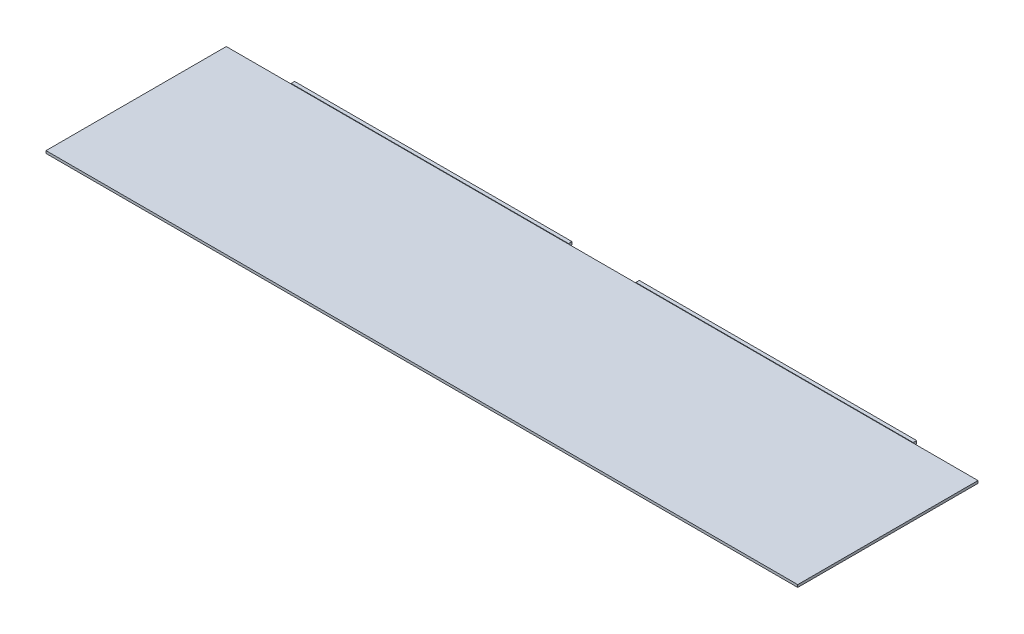
ISO-10303-21;
HEADER;
FILE_DESCRIPTION(('STEP AP214'),'2;1');
FILE_NAME('part.step','',(''),(''),'','','');
FILE_SCHEMA(('AUTOMOTIVE_DESIGN { 1 0 10303 214 1 1 1 1 }'));
ENDSEC;
DATA;
#1=APPLICATION_CONTEXT('core data for automotive mechanical design processes');
#2=APPLICATION_PROTOCOL_DEFINITION('international standard','automotive_design',2000,#1);
#3=PRODUCT_CONTEXT('',#1,'mechanical');
#4=PRODUCT('Part','Part','',(#3));
#5=PRODUCT_RELATED_PRODUCT_CATEGORY('part','',(#4));
#6=PRODUCT_DEFINITION_FORMATION('','',#4);
#7=PRODUCT_DEFINITION_CONTEXT('part definition',#1,'design');
#8=PRODUCT_DEFINITION('design','',#6,#7);
#9=PRODUCT_DEFINITION_SHAPE('','',#8);
#10=(LENGTH_UNIT() NAMED_UNIT(*) SI_UNIT(.MILLI.,.METRE.));
#11=(NAMED_UNIT(*) PLANE_ANGLE_UNIT() SI_UNIT($,.RADIAN.));
#12=(NAMED_UNIT(*) SI_UNIT($,.STERADIAN.) SOLID_ANGLE_UNIT());
#13=UNCERTAINTY_MEASURE_WITH_UNIT(LENGTH_MEASURE(1.E-05),#10,'distance_accuracy_value','');
#14=(GEOMETRIC_REPRESENTATION_CONTEXT(3) GLOBAL_UNCERTAINTY_ASSIGNED_CONTEXT((#13)) GLOBAL_UNIT_ASSIGNED_CONTEXT((#10,
#11,#12)) REPRESENTATION_CONTEXT('',''));
#15=CARTESIAN_POINT('',(0.,0.,0.));
#16=DIRECTION('',(0.,0.,1.));
#17=DIRECTION('',(1.,0.,0.));
#18=AXIS2_PLACEMENT_3D('',#15,#16,#17);
#19=CARTESIAN_POINT('',(-344.2208,1.143,-82.55));
#20=DIRECTION('',(0.,0.,1.));
#21=DIRECTION('',(1.,0.,0.));
#22=AXIS2_PLACEMENT_3D('',#19,#20,#21);
#23=PLANE('',#22);
#24=DIRECTION('',(0.,-1.,0.));
#25=VECTOR('',#24,1.);
#26=CARTESIAN_POINT('',(284.822900000001,-1.143,-82.55));
#27=LINE('',#26,#25);
#28=CARTESIAN_POINT('',(284.822900000002,1.143,-82.55));
#29=VERTEX_POINT('',#28);
#30=CARTESIAN_POINT('',(284.822900000002,-1.143,-82.55));
#31=VERTEX_POINT('',#30);
#32=EDGE_CURVE('E58',#29,#31,#27,.T.);
#33=ORIENTED_EDGE('',*,*,#32,.F.);
#34=DIRECTION('',(-1.,0.,0.));
#35=VECTOR('',#34,1.);
#36=CARTESIAN_POINT('',(-344.2208,1.143,-82.55));
#37=LINE('',#36,#35);
#38=CARTESIAN_POINT('',(344.2208,1.143,-82.55));
#39=VERTEX_POINT('',#38);
#40=EDGE_CURVE('E203',#39,#29,#37,.T.);
#41=ORIENTED_EDGE('',*,*,#40,.F.);
#42=DIRECTION('',(0.,-1.,0.));
#43=VECTOR('',#42,1.);
#44=CARTESIAN_POINT('',(344.2208,1.143,-82.55));
#45=LINE('',#44,#43);
#46=CARTESIAN_POINT('',(344.2208,-1.143,-82.55));
#47=VERTEX_POINT('',#46);
#48=EDGE_CURVE('E37',#39,#47,#45,.T.);
#49=ORIENTED_EDGE('',*,*,#48,.T.);
#50=DIRECTION('',(-1.,0.,0.));
#51=VECTOR('',#50,1.);
#52=CARTESIAN_POINT('',(-344.2208,-1.143,-82.55));
#53=LINE('',#52,#51);
#54=EDGE_CURVE('E214',#47,#31,#53,.T.);
#55=ORIENTED_EDGE('',*,*,#54,.T.);
#56=EDGE_LOOP('',(#33,#41,#49,#55));
#57=FACE_BOUND('',#56,.T.);
#58=ADVANCED_FACE('F33',(#57),#23,.F.);
#59=DIRECTION('',(0.,1.,0.));
#60=VECTOR('',#59,1.);
#61=CARTESIAN_POINT('',(30.8229000000015,1.58749999999994,-82.55));
#62=LINE('',#61,#60);
#63=CARTESIAN_POINT('',(30.8229000000015,-1.143,-82.55));
#64=VERTEX_POINT('',#63);
#65=CARTESIAN_POINT('',(30.8229000000014,1.143,-82.55));
#66=VERTEX_POINT('',#65);
#67=EDGE_CURVE('E252',#64,#66,#62,.T.);
#68=ORIENTED_EDGE('',*,*,#67,.F.);
#69=CARTESIAN_POINT('',(-30.8229000000015,-1.143,-82.55));
#70=VERTEX_POINT('',#69);
#71=EDGE_CURVE('E217',#64,#70,#53,.T.);
#72=ORIENTED_EDGE('',*,*,#71,.T.);
#73=DIRECTION('',(0.,-1.,0.));
#74=VECTOR('',#73,1.);
#75=CARTESIAN_POINT('',(-30.8229000000015,-1.143,-82.55));
#76=LINE('',#75,#74);
#77=CARTESIAN_POINT('',(-30.8229000000015,1.143,-82.55));
#78=VERTEX_POINT('',#77);
#79=EDGE_CURVE('E11',#78,#70,#76,.T.);
#80=ORIENTED_EDGE('',*,*,#79,.F.);
#81=EDGE_CURVE('E50',#66,#78,#37,.T.);
#82=ORIENTED_EDGE('',*,*,#81,.F.);
#83=EDGE_LOOP('',(#68,#72,#80,#82));
#84=FACE_BOUND('',#83,.T.);
#85=ADVANCED_FACE('F250',(#84),#23,.F.);
#86=DIRECTION('',(0.,1.,0.));
#87=VECTOR('',#86,1.);
#88=CARTESIAN_POINT('',(-284.822900000001,1.58749999999994,-82.55));
#89=LINE('',#88,#87);
#90=CARTESIAN_POINT('',(-284.822900000001,-1.143,-82.55));
#91=VERTEX_POINT('',#90);
#92=CARTESIAN_POINT('',(-284.822900000001,1.143,-82.55));
#93=VERTEX_POINT('',#92);
#94=EDGE_CURVE('E182',#91,#93,#89,.T.);
#95=ORIENTED_EDGE('',*,*,#94,.F.);
#96=CARTESIAN_POINT('',(-344.2208,-1.143,-82.55));
#97=VERTEX_POINT('',#96);
#98=EDGE_CURVE('E213',#91,#97,#53,.T.);
#99=ORIENTED_EDGE('',*,*,#98,.T.);
#100=DIRECTION('',(0.,-1.,0.));
#101=VECTOR('',#100,1.);
#102=CARTESIAN_POINT('',(-344.2208,1.143,-82.55));
#103=LINE('',#102,#101);
#104=CARTESIAN_POINT('',(-344.2208,1.143,-82.55));
#105=VERTEX_POINT('',#104);
#106=EDGE_CURVE('E224',#105,#97,#103,.T.);
#107=ORIENTED_EDGE('',*,*,#106,.F.);
#108=EDGE_CURVE('E201',#93,#105,#37,.T.);
#109=ORIENTED_EDGE('',*,*,#108,.F.);
#110=EDGE_LOOP('',(#95,#99,#107,#109));
#111=FACE_BOUND('',#110,.T.);
#112=ADVANCED_FACE('F248',(#111),#23,.F.);
#113=CARTESIAN_POINT('',(344.2208,1.143,-82.55));
#114=DIRECTION('',(-1.,0.,0.));
#115=DIRECTION('',(0.,0.,1.));
#116=AXIS2_PLACEMENT_3D('',#113,#114,#115);
#117=PLANE('',#116);
#118=DIRECTION('',(0.,0.,-1.));
#119=VECTOR('',#118,1.);
#120=CARTESIAN_POINT('',(344.2208,-1.143,-82.55));
#121=LINE('',#120,#119);
#122=CARTESIAN_POINT('',(344.2208,-1.143,82.55));
#123=VERTEX_POINT('',#122);
#124=EDGE_CURVE('E197',#123,#47,#121,.T.);
#125=ORIENTED_EDGE('',*,*,#124,.T.);
#126=ORIENTED_EDGE('',*,*,#48,.F.);
#127=DIRECTION('',(0.,0.,-1.));
#128=VECTOR('',#127,1.);
#129=CARTESIAN_POINT('',(344.2208,1.143,-82.55));
#130=LINE('',#129,#128);
#131=CARTESIAN_POINT('',(344.2208,1.143,82.55));
#132=VERTEX_POINT('',#131);
#133=EDGE_CURVE('E198',#132,#39,#130,.T.);
#134=ORIENTED_EDGE('',*,*,#133,.F.);
#135=DIRECTION('',(0.,-1.,0.));
#136=VECTOR('',#135,1.);
#137=CARTESIAN_POINT('',(344.2208,1.143,82.55));
#138=LINE('',#137,#136);
#139=EDGE_CURVE('E210',#132,#123,#138,.T.);
#140=ORIENTED_EDGE('',*,*,#139,.T.);
#141=EDGE_LOOP('',(#125,#126,#134,#140));
#142=FACE_BOUND('',#141,.T.);
#143=ADVANCED_FACE('F35',(#142),#117,.F.);
#144=CARTESIAN_POINT('',(-344.2208,1.143,-82.55));
#145=DIRECTION('',(1.,0.,0.));
#146=DIRECTION('',(0.,0.,-1.));
#147=AXIS2_PLACEMENT_3D('',#144,#145,#146);
#148=PLANE('',#147);
#149=DIRECTION('',(0.,0.,1.));
#150=VECTOR('',#149,1.);
#151=CARTESIAN_POINT('',(-344.2208,-1.143,-82.55));
#152=LINE('',#151,#150);
#153=CARTESIAN_POINT('',(-344.2208,-1.143,82.55));
#154=VERTEX_POINT('',#153);
#155=EDGE_CURVE('E216',#97,#154,#152,.T.);
#156=ORIENTED_EDGE('',*,*,#155,.T.);
#157=DIRECTION('',(0.,-1.,0.));
#158=VECTOR('',#157,1.);
#159=CARTESIAN_POINT('',(-344.2208,1.143,82.55));
#160=LINE('',#159,#158);
#161=CARTESIAN_POINT('',(-344.2208,1.143,82.55));
#162=VERTEX_POINT('',#161);
#163=EDGE_CURVE('E222',#162,#154,#160,.T.);
#164=ORIENTED_EDGE('',*,*,#163,.F.);
#165=DIRECTION('',(0.,0.,1.));
#166=VECTOR('',#165,1.);
#167=CARTESIAN_POINT('',(-344.2208,1.143,-82.55));
#168=LINE('',#167,#166);
#169=EDGE_CURVE('E205',#105,#162,#168,.T.);
#170=ORIENTED_EDGE('',*,*,#169,.F.);
#171=ORIENTED_EDGE('',*,*,#106,.T.);
#172=EDGE_LOOP('',(#156,#164,#170,#171));
#173=FACE_BOUND('',#172,.T.);
#174=ADVANCED_FACE('F241',(#173),#148,.F.);
#175=CARTESIAN_POINT('',(-344.2208,1.143,82.55));
#176=DIRECTION('',(0.,0.,-1.));
#177=DIRECTION('',(-1.,0.,0.));
#178=AXIS2_PLACEMENT_3D('',#175,#176,#177);
#179=PLANE('',#178);
#180=DIRECTION('',(1.,0.,0.));
#181=VECTOR('',#180,1.);
#182=CARTESIAN_POINT('',(-344.2208,-1.143,82.55));
#183=LINE('',#182,#181);
#184=EDGE_CURVE('E202',#154,#123,#183,.T.);
#185=ORIENTED_EDGE('',*,*,#184,.T.);
#186=ORIENTED_EDGE('',*,*,#139,.F.);
#187=DIRECTION('',(1.,0.,0.));
#188=VECTOR('',#187,1.);
#189=CARTESIAN_POINT('',(-344.2208,1.143,82.55));
#190=LINE('',#189,#188);
#191=EDGE_CURVE('E208',#162,#132,#190,.T.);
#192=ORIENTED_EDGE('',*,*,#191,.F.);
#193=ORIENTED_EDGE('',*,*,#163,.T.);
#194=EDGE_LOOP('',(#185,#186,#192,#193));
#195=FACE_BOUND('',#194,.T.);
#196=ADVANCED_FACE('F238',(#195),#179,.F.);
#197=CARTESIAN_POINT('',(0.,1.143,0.));
#198=DIRECTION('',(0.,1.,0.));
#199=DIRECTION('',(0.,0.,1.));
#200=AXIS2_PLACEMENT_3D('',#197,#198,#199);
#201=PLANE('',#200);
#202=ORIENTED_EDGE('',*,*,#133,.T.);
#203=ORIENTED_EDGE('',*,*,#40,.T.);
#204=DIRECTION('',(1.,0.,0.));
#205=VECTOR('',#204,1.);
#206=CARTESIAN_POINT('',(0.,1.143,-82.55));
#207=LINE('',#206,#205);
#208=EDGE_CURVE('E161',#66,#29,#207,.T.);
#209=ORIENTED_EDGE('',*,*,#208,.F.);
#210=ORIENTED_EDGE('',*,*,#81,.T.);
#211=EDGE_CURVE('E206',#78,#93,#37,.T.);
#212=ORIENTED_EDGE('',*,*,#211,.T.);
#213=ORIENTED_EDGE('',*,*,#108,.T.);
#214=ORIENTED_EDGE('',*,*,#169,.T.);
#215=ORIENTED_EDGE('',*,*,#191,.T.);
#216=EDGE_LOOP('',(#202,#203,#209,#210,#212,#213,#214,#215));
#217=FACE_BOUND('',#216,.T.);
#218=ADVANCED_FACE('F243',(#217),#201,.T.);
#219=CARTESIAN_POINT('',(0.,-1.143,0.));
#220=DIRECTION('',(0.,1.,0.));
#221=DIRECTION('',(0.,0.,1.));
#222=AXIS2_PLACEMENT_3D('',#219,#220,#221);
#223=PLANE('',#222);
#224=ORIENTED_EDGE('',*,*,#124,.F.);
#225=ORIENTED_EDGE('',*,*,#184,.F.);
#226=ORIENTED_EDGE('',*,*,#155,.F.);
#227=ORIENTED_EDGE('',*,*,#98,.F.);
#228=DIRECTION('',(0.,0.,1.));
#229=VECTOR('',#228,1.);
#230=CARTESIAN_POINT('',(-284.822900000001,-1.143,-85.725));
#231=LINE('',#230,#229);
#232=CARTESIAN_POINT('',(-284.822900000001,-1.143,-85.725));
#233=VERTEX_POINT('',#232);
#234=EDGE_CURVE('E191',#233,#91,#231,.T.);
#235=ORIENTED_EDGE('',*,*,#234,.F.);
#236=DIRECTION('',(-1.,0.,0.));
#237=VECTOR('',#236,1.);
#238=CARTESIAN_POINT('',(-30.8229000000015,-1.143,-85.725));
#239=LINE('',#238,#237);
#240=CARTESIAN_POINT('',(-30.8229000000015,-1.143,-85.725));
#241=VERTEX_POINT('',#240);
#242=EDGE_CURVE('E172',#241,#233,#239,.T.);
#243=ORIENTED_EDGE('',*,*,#242,.F.);
#244=DIRECTION('',(0.,0.,1.));
#245=VECTOR('',#244,1.);
#246=CARTESIAN_POINT('',(-30.8229000000015,-1.143,-85.725));
#247=LINE('',#246,#245);
#248=EDGE_CURVE('E194',#241,#70,#247,.T.);
#249=ORIENTED_EDGE('',*,*,#248,.T.);
#250=ORIENTED_EDGE('',*,*,#71,.F.);
#251=DIRECTION('',(0.,0.,1.));
#252=VECTOR('',#251,1.);
#253=CARTESIAN_POINT('',(30.8229000000015,-1.143,-85.725));
#254=LINE('',#253,#252);
#255=CARTESIAN_POINT('',(30.8229000000015,-1.143,-85.725));
#256=VERTEX_POINT('',#255);
#257=EDGE_CURVE('E144',#256,#64,#254,.T.);
#258=ORIENTED_EDGE('',*,*,#257,.F.);
#259=DIRECTION('',(-1.,0.,0.));
#260=VECTOR('',#259,1.);
#261=CARTESIAN_POINT('',(284.822900000001,-1.143,-85.725));
#262=LINE('',#261,#260);
#263=CARTESIAN_POINT('',(284.822900000001,-1.143,-85.725));
#264=VERTEX_POINT('',#263);
#265=EDGE_CURVE('E137',#264,#256,#262,.T.);
#266=ORIENTED_EDGE('',*,*,#265,.F.);
#267=DIRECTION('',(0.,0.,1.));
#268=VECTOR('',#267,1.);
#269=CARTESIAN_POINT('',(284.822900000001,-1.143,-85.725));
#270=LINE('',#269,#268);
#271=EDGE_CURVE('E142',#264,#31,#270,.T.);
#272=ORIENTED_EDGE('',*,*,#271,.T.);
#273=ORIENTED_EDGE('',*,*,#54,.F.);
#274=EDGE_LOOP('',(#224,#225,#226,#227,#235,#243,#249,#250,#258,#266,#272,#273));
#275=FACE_BOUND('',#274,.T.);
#276=ADVANCED_FACE('F140',(#275),#223,.F.);
#277=CARTESIAN_POINT('',(0.,0.,-82.55));
#278=DIRECTION('',(0.,0.,1.));
#279=DIRECTION('',(1.,0.,0.));
#280=AXIS2_PLACEMENT_3D('',#277,#278,#279);
#281=PLANE('',#280);
#282=ORIENTED_EDGE('',*,*,#211,.F.);
#283=CARTESIAN_POINT('',(-30.8229000000015,1.58749999999994,-82.55));
#284=VERTEX_POINT('',#283);
#285=EDGE_CURVE('E43',#284,#78,#76,.T.);
#286=ORIENTED_EDGE('',*,*,#285,.F.);
#287=DIRECTION('',(1.,0.,0.));
#288=VECTOR('',#287,1.);
#289=CARTESIAN_POINT('',(-30.8229000000015,1.58749999999994,-82.55));
#290=LINE('',#289,#288);
#291=CARTESIAN_POINT('',(-284.822900000001,1.58749999999994,-82.55));
#292=VERTEX_POINT('',#291);
#293=EDGE_CURVE('E173',#292,#284,#290,.T.);
#294=ORIENTED_EDGE('',*,*,#293,.F.);
#295=EDGE_CURVE('E181',#93,#292,#89,.T.);
#296=ORIENTED_EDGE('',*,*,#295,.F.);
#297=EDGE_LOOP('',(#282,#286,#294,#296));
#298=FACE_BOUND('',#297,.T.);
#299=ADVANCED_FACE('F266',(#298),#281,.T.);
#300=CARTESIAN_POINT('',(-30.8229000000015,-1.143,-85.725));
#301=DIRECTION('',(-1.,0.,0.));
#302=DIRECTION('',(0.,0.,1.));
#303=AXIS2_PLACEMENT_3D('',#300,#301,#302);
#304=PLANE('',#303);
#305=ORIENTED_EDGE('',*,*,#285,.T.);
#306=ORIENTED_EDGE('',*,*,#79,.T.);
#307=ORIENTED_EDGE('',*,*,#248,.F.);
#308=DIRECTION('',(0.,-1.,0.));
#309=VECTOR('',#308,1.);
#310=CARTESIAN_POINT('',(-30.8229000000015,-1.143,-85.725));
#311=LINE('',#310,#309);
#312=CARTESIAN_POINT('',(-30.8229000000015,1.58749999999994,-85.725));
#313=VERTEX_POINT('',#312);
#314=EDGE_CURVE('E169',#313,#241,#311,.T.);
#315=ORIENTED_EDGE('',*,*,#314,.F.);
#316=DIRECTION('',(0.,0.,1.));
#317=VECTOR('',#316,1.);
#318=CARTESIAN_POINT('',(-30.8229000000015,1.58749999999994,-85.725));
#319=LINE('',#318,#317);
#320=EDGE_CURVE('E178',#313,#284,#319,.T.);
#321=ORIENTED_EDGE('',*,*,#320,.T.);
#322=EDGE_LOOP('',(#305,#306,#307,#315,#321));
#323=FACE_BOUND('',#322,.T.);
#324=ADVANCED_FACE('F255',(#323),#304,.F.);
#325=CARTESIAN_POINT('',(-284.822900000001,1.58749999999994,-85.725));
#326=DIRECTION('',(1.,0.,0.));
#327=DIRECTION('',(0.,1.,0.));
#328=AXIS2_PLACEMENT_3D('',#325,#326,#327);
#329=PLANE('',#328);
#330=ORIENTED_EDGE('',*,*,#94,.T.);
#331=ORIENTED_EDGE('',*,*,#295,.T.);
#332=DIRECTION('',(0.,0.,1.));
#333=VECTOR('',#332,1.);
#334=CARTESIAN_POINT('',(-284.822900000001,1.58749999999994,-85.725));
#335=LINE('',#334,#333);
#336=CARTESIAN_POINT('',(-284.822900000001,1.58749999999994,-85.725));
#337=VERTEX_POINT('',#336);
#338=EDGE_CURVE('E188',#337,#292,#335,.T.);
#339=ORIENTED_EDGE('',*,*,#338,.F.);
#340=DIRECTION('',(0.,1.,0.));
#341=VECTOR('',#340,1.);
#342=CARTESIAN_POINT('',(-284.822900000001,1.58749999999994,-85.725));
#343=LINE('',#342,#341);
#344=EDGE_CURVE('E175',#233,#337,#343,.T.);
#345=ORIENTED_EDGE('',*,*,#344,.F.);
#346=ORIENTED_EDGE('',*,*,#234,.T.);
#347=EDGE_LOOP('',(#330,#331,#339,#345,#346));
#348=FACE_BOUND('',#347,.T.);
#349=ADVANCED_FACE('F319',(#348),#329,.F.);
#350=CARTESIAN_POINT('',(-30.8229000000015,1.58749999999994,-85.725));
#351=DIRECTION('',(0.,-1.,0.));
#352=DIRECTION('',(0.,0.,-1.));
#353=AXIS2_PLACEMENT_3D('',#350,#351,#352);
#354=PLANE('',#353);
#355=ORIENTED_EDGE('',*,*,#293,.T.);
#356=ORIENTED_EDGE('',*,*,#320,.F.);
#357=DIRECTION('',(1.,0.,0.));
#358=VECTOR('',#357,1.);
#359=CARTESIAN_POINT('',(-30.8229000000015,1.58749999999994,-85.725));
#360=LINE('',#359,#358);
#361=EDGE_CURVE('E177',#337,#313,#360,.T.);
#362=ORIENTED_EDGE('',*,*,#361,.F.);
#363=ORIENTED_EDGE('',*,*,#338,.T.);
#364=EDGE_LOOP('',(#355,#356,#362,#363));
#365=FACE_BOUND('',#364,.T.);
#366=ADVANCED_FACE('F322',(#365),#354,.F.);
#367=CARTESIAN_POINT('',(0.,0.,-85.725));
#368=DIRECTION('',(0.,0.,1.));
#369=DIRECTION('',(1.,0.,0.));
#370=AXIS2_PLACEMENT_3D('',#367,#368,#369);
#371=PLANE('',#370);
#372=ORIENTED_EDGE('',*,*,#314,.T.);
#373=ORIENTED_EDGE('',*,*,#242,.T.);
#374=ORIENTED_EDGE('',*,*,#344,.T.);
#375=ORIENTED_EDGE('',*,*,#361,.T.);
#376=EDGE_LOOP('',(#372,#373,#374,#375));
#377=FACE_BOUND('',#376,.T.);
#378=ADVANCED_FACE('F260',(#377),#371,.F.);
#379=CARTESIAN_POINT('',(284.822900000001,-1.143,-85.725));
#380=DIRECTION('',(-1.,0.,0.));
#381=DIRECTION('',(0.,-1.,0.));
#382=AXIS2_PLACEMENT_3D('',#379,#380,#381);
#383=PLANE('',#382);
#384=CARTESIAN_POINT('',(284.822900000001,1.58749999999994,-82.55));
#385=VERTEX_POINT('',#384);
#386=EDGE_CURVE('E276',#385,#29,#27,.T.);
#387=ORIENTED_EDGE('',*,*,#386,.T.);
#388=ORIENTED_EDGE('',*,*,#32,.T.);
#389=ORIENTED_EDGE('',*,*,#271,.F.);
#390=DIRECTION('',(0.,-1.,0.));
#391=VECTOR('',#390,1.);
#392=CARTESIAN_POINT('',(284.822900000001,-1.143,-85.725));
#393=LINE('',#392,#391);
#394=CARTESIAN_POINT('',(284.822900000001,1.58749999999994,-85.725));
#395=VERTEX_POINT('',#394);
#396=EDGE_CURVE('E148',#395,#264,#393,.T.);
#397=ORIENTED_EDGE('',*,*,#396,.F.);
#398=DIRECTION('',(0.,0.,1.));
#399=VECTOR('',#398,1.);
#400=CARTESIAN_POINT('',(284.822900000001,1.58749999999994,-85.725));
#401=LINE('',#400,#399);
#402=EDGE_CURVE('E283',#395,#385,#401,.T.);
#403=ORIENTED_EDGE('',*,*,#402,.T.);
#404=EDGE_LOOP('',(#387,#388,#389,#397,#403));
#405=FACE_BOUND('',#404,.T.);
#406=ADVANCED_FACE('F160',(#405),#383,.F.);
#407=CARTESIAN_POINT('',(30.8229000000015,1.58749999999994,-85.725));
#408=DIRECTION('',(1.,0.,0.));
#409=DIRECTION('',(0.,0.,-1.));
#410=AXIS2_PLACEMENT_3D('',#407,#408,#409);
#411=PLANE('',#410);
#412=ORIENTED_EDGE('',*,*,#67,.T.);
#413=CARTESIAN_POINT('',(30.8229000000015,1.58749999999994,-82.55));
#414=VERTEX_POINT('',#413);
#415=EDGE_CURVE('E271',#66,#414,#62,.T.);
#416=ORIENTED_EDGE('',*,*,#415,.T.);
#417=DIRECTION('',(0.,0.,1.));
#418=VECTOR('',#417,1.);
#419=CARTESIAN_POINT('',(30.8229000000015,1.58749999999994,-85.725));
#420=LINE('',#419,#418);
#421=CARTESIAN_POINT('',(30.8229000000015,1.58749999999994,-85.725));
#422=VERTEX_POINT('',#421);
#423=EDGE_CURVE('E165',#422,#414,#420,.T.);
#424=ORIENTED_EDGE('',*,*,#423,.F.);
#425=DIRECTION('',(0.,1.,0.));
#426=VECTOR('',#425,1.);
#427=CARTESIAN_POINT('',(30.8229000000015,1.58749999999994,-85.725));
#428=LINE('',#427,#426);
#429=EDGE_CURVE('E147',#256,#422,#428,.T.);
#430=ORIENTED_EDGE('',*,*,#429,.F.);
#431=ORIENTED_EDGE('',*,*,#257,.T.);
#432=EDGE_LOOP('',(#412,#416,#424,#430,#431));
#433=FACE_BOUND('',#432,.T.);
#434=ADVANCED_FACE('F278',(#433),#411,.F.);
#435=CARTESIAN_POINT('',(284.822900000001,1.58749999999994,-85.725));
#436=DIRECTION('',(0.,-1.,0.));
#437=DIRECTION('',(0.,0.,-1.));
#438=AXIS2_PLACEMENT_3D('',#435,#436,#437);
#439=PLANE('',#438);
#440=DIRECTION('',(1.,0.,0.));
#441=VECTOR('',#440,1.);
#442=CARTESIAN_POINT('',(284.822900000001,1.58749999999994,-82.55));
#443=LINE('',#442,#441);
#444=EDGE_CURVE('E157',#414,#385,#443,.T.);
#445=ORIENTED_EDGE('',*,*,#444,.T.);
#446=ORIENTED_EDGE('',*,*,#402,.F.);
#447=DIRECTION('',(1.,0.,0.));
#448=VECTOR('',#447,1.);
#449=CARTESIAN_POINT('',(284.822900000001,1.58749999999994,-85.725));
#450=LINE('',#449,#448);
#451=EDGE_CURVE('E153',#422,#395,#450,.T.);
#452=ORIENTED_EDGE('',*,*,#451,.F.);
#453=ORIENTED_EDGE('',*,*,#423,.T.);
#454=EDGE_LOOP('',(#445,#446,#452,#453));
#455=FACE_BOUND('',#454,.T.);
#456=ADVANCED_FACE('F285',(#455),#439,.F.);
#457=CARTESIAN_POINT('',(0.,0.,-85.725));
#458=DIRECTION('',(0.,0.,1.));
#459=DIRECTION('',(1.,0.,0.));
#460=AXIS2_PLACEMENT_3D('',#457,#458,#459);
#461=PLANE('',#460);
#462=ORIENTED_EDGE('',*,*,#396,.T.);
#463=ORIENTED_EDGE('',*,*,#265,.T.);
#464=ORIENTED_EDGE('',*,*,#429,.T.);
#465=ORIENTED_EDGE('',*,*,#451,.T.);
#466=EDGE_LOOP('',(#462,#463,#464,#465));
#467=FACE_BOUND('',#466,.T.);
#468=ADVANCED_FACE('F151',(#467),#461,.F.);
#469=CARTESIAN_POINT('',(0.,0.,-82.55));
#470=DIRECTION('',(0.,0.,1.));
#471=DIRECTION('',(1.,0.,0.));
#472=AXIS2_PLACEMENT_3D('',#469,#470,#471);
#473=PLANE('',#472);
#474=ORIENTED_EDGE('',*,*,#415,.F.);
#475=ORIENTED_EDGE('',*,*,#208,.T.);
#476=ORIENTED_EDGE('',*,*,#386,.F.);
#477=ORIENTED_EDGE('',*,*,#444,.F.);
#478=EDGE_LOOP('',(#474,#475,#476,#477));
#479=FACE_BOUND('',#478,.T.);
#480=ADVANCED_FACE('F272',(#479),#473,.T.);
#481=CLOSED_SHELL('',(#58,#85,#112,#143,#174,#196,#218,#276,#299,#324,#349,#366,#378,#406,#434,
#456,#468,#480));
#482=MANIFOLD_SOLID_BREP('B2',#481);
#483=ADVANCED_BREP_SHAPE_REPRESENTATION('',(#18,#482),#14);
#484=SHAPE_DEFINITION_REPRESENTATION(#9,#483);
ENDSEC;
END-ISO-10303-21;
